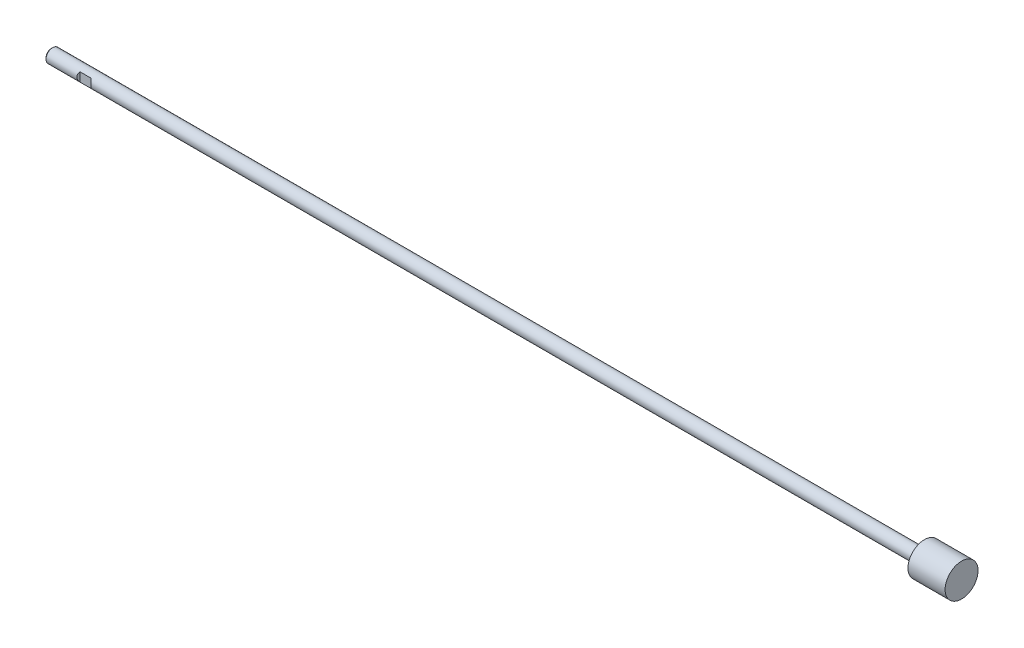
ISO-10303-21;
HEADER;
FILE_DESCRIPTION(('STEP AP214'),'2;1');
FILE_NAME('part.step','',(''),(''),'','','');
FILE_SCHEMA(('AUTOMOTIVE_DESIGN { 1 0 10303 214 1 1 1 1 }'));
ENDSEC;
DATA;
#1=APPLICATION_CONTEXT('core data for automotive mechanical design processes');
#2=APPLICATION_PROTOCOL_DEFINITION('international standard','automotive_design',2000,#1);
#3=PRODUCT_CONTEXT('',#1,'mechanical');
#4=PRODUCT('Part','Part','',(#3));
#5=PRODUCT_RELATED_PRODUCT_CATEGORY('part','',(#4));
#6=PRODUCT_DEFINITION_FORMATION('','',#4);
#7=PRODUCT_DEFINITION_CONTEXT('part definition',#1,'design');
#8=PRODUCT_DEFINITION('design','',#6,#7);
#9=PRODUCT_DEFINITION_SHAPE('','',#8);
#10=(LENGTH_UNIT() NAMED_UNIT(*) SI_UNIT(.MILLI.,.METRE.));
#11=(NAMED_UNIT(*) PLANE_ANGLE_UNIT() SI_UNIT($,.RADIAN.));
#12=(NAMED_UNIT(*) SI_UNIT($,.STERADIAN.) SOLID_ANGLE_UNIT());
#13=UNCERTAINTY_MEASURE_WITH_UNIT(LENGTH_MEASURE(1.E-05),#10,'distance_accuracy_value','');
#14=(GEOMETRIC_REPRESENTATION_CONTEXT(3) GLOBAL_UNCERTAINTY_ASSIGNED_CONTEXT((#13)) GLOBAL_UNIT_ASSIGNED_CONTEXT((#10,
#11,#12)) REPRESENTATION_CONTEXT('',''));
#15=CARTESIAN_POINT('',(0.,0.,0.));
#16=DIRECTION('',(0.,0.,1.));
#17=DIRECTION('',(1.,0.,0.));
#18=AXIS2_PLACEMENT_3D('',#15,#16,#17);
#19=CARTESIAN_POINT('',(0.,0.,0.));
#20=DIRECTION('',(1.,0.,0.));
#21=DIRECTION('',(0.,0.,-1.));
#22=AXIS2_PLACEMENT_3D('',#19,#20,#21);
#23=PLANE('',#22);
#24=CARTESIAN_POINT('',(0.,0.,0.));
#25=DIRECTION('',(-1.,0.,0.));
#26=DIRECTION('',(0.,0.,1.));
#27=AXIS2_PLACEMENT_3D('',#24,#25,#26);
#28=CIRCLE('',#27,3.233);
#29=CARTESIAN_POINT('',(0.,0.,3.233));
#30=VERTEX_POINT('',#29);
#31=EDGE_CURVE('E83',#30,#30,#28,.T.);
#32=ORIENTED_EDGE('',*,*,#31,.T.);
#33=EDGE_LOOP('',(#32));
#34=FACE_BOUND('',#33,.T.);
#35=ADVANCED_FACE('F39',(#34),#23,.F.);
#36=CARTESIAN_POINT('',(0.766999999999962,0.,0.));
#37=DIRECTION('',(1.,0.,0.));
#38=DIRECTION('',(0.,0.,-1.));
#39=AXIS2_PLACEMENT_3D('',#36,#37,#38);
#40=CONICAL_SURFACE('',#39,4.,0.785398163397473);
#41=ORIENTED_EDGE('',*,*,#31,.F.);
#42=EDGE_LOOP('',(#41));
#43=FACE_BOUND('',#42,.T.);
#44=CARTESIAN_POINT('',(0.766999999999962,0.,0.));
#45=DIRECTION('',(-1.,0.,0.));
#46=DIRECTION('',(0.,0.,1.));
#47=AXIS2_PLACEMENT_3D('',#44,#45,#46);
#48=CIRCLE('',#47,4.);
#49=CARTESIAN_POINT('',(0.766999999999962,0.,4.));
#50=VERTEX_POINT('',#49);
#51=EDGE_CURVE('E128',#50,#50,#48,.T.);
#52=ORIENTED_EDGE('',*,*,#51,.T.);
#53=EDGE_LOOP('',(#52));
#54=FACE_BOUND('',#53,.T.);
#55=ADVANCED_FACE('F134',(#43,#54),#40,.T.);
#56=CARTESIAN_POINT('',(539.,0.,0.));
#57=DIRECTION('',(-1.,0.,0.));
#58=DIRECTION('',(0.,0.,1.));
#59=AXIS2_PLACEMENT_3D('',#56,#57,#58);
#60=CYLINDRICAL_SURFACE('',#59,4.);
#61=DIRECTION('',(-1.,0.,0.));
#62=VECTOR('',#61,1.);
#63=CARTESIAN_POINT('',(539.,-2.64575131106459,-3.));
#64=LINE('',#63,#62);
#65=CARTESIAN_POINT('',(20.,-2.64575131106458,-3.));
#66=VERTEX_POINT('',#65);
#67=CARTESIAN_POINT('',(26.4,-2.64575131106459,-3.));
#68=VERTEX_POINT('',#67);
#69=EDGE_CURVE('E104',#66,#68,#64,.F.);
#70=ORIENTED_EDGE('',*,*,#69,.T.);
#71=CARTESIAN_POINT('',(23.4,0.,0.));
#72=DIRECTION('',(0.707106781186548,0.,0.707106781186548));
#73=DIRECTION('',(-0.707106781186548,0.,0.707106781186548));
#74=AXIS2_PLACEMENT_3D('',#71,#72,#73);
#75=ELLIPSE('',#74,5.65685424949238,4.);
#76=CARTESIAN_POINT('',(26.4,2.64575131106459,-3.));
#77=VERTEX_POINT('',#76);
#78=EDGE_CURVE('E11',#68,#77,#75,.T.);
#79=ORIENTED_EDGE('',*,*,#78,.T.);
#80=DIRECTION('',(-1.,0.,0.));
#81=VECTOR('',#80,1.);
#82=CARTESIAN_POINT('',(539.,2.64575131106459,-3.));
#83=LINE('',#82,#81);
#84=CARTESIAN_POINT('',(20.,2.64575131106458,-3.));
#85=VERTEX_POINT('',#84);
#86=EDGE_CURVE('E46',#77,#85,#83,.T.);
#87=ORIENTED_EDGE('',*,*,#86,.T.);
#88=CARTESIAN_POINT('',(23.,0.,0.));
#89=DIRECTION('',(-0.707106781186548,0.,0.707106781186547));
#90=DIRECTION('',(-0.707106781186547,0.,-0.707106781186548));
#91=AXIS2_PLACEMENT_3D('',#88,#89,#90);
#92=ELLIPSE('',#91,5.65685424949238,4.);
#93=EDGE_CURVE('E101',#85,#66,#92,.T.);
#94=ORIENTED_EDGE('',*,*,#93,.T.);
#95=EDGE_LOOP('',(#70,#79,#87,#94));
#96=FACE_BOUND('',#95,.T.);
#97=DIRECTION('',(-1.,0.,0.));
#98=VECTOR('',#97,1.);
#99=CARTESIAN_POINT('',(539.,-2.64575131106459,3.));
#100=LINE('',#99,#98);
#101=CARTESIAN_POINT('',(26.4,-2.64575131106458,3.));
#102=VERTEX_POINT('',#101);
#103=CARTESIAN_POINT('',(20.,-2.64575131106459,3.));
#104=VERTEX_POINT('',#103);
#105=EDGE_CURVE('E89',#102,#104,#100,.T.);
#106=ORIENTED_EDGE('',*,*,#105,.T.);
#107=CARTESIAN_POINT('',(23.0000000000001,0.,0.));
#108=DIRECTION('',(-0.707106781186547,0.,-0.707106781186548));
#109=DIRECTION('',(-0.707106781186548,0.,0.707106781186547));
#110=AXIS2_PLACEMENT_3D('',#107,#108,#109);
#111=ELLIPSE('',#110,5.65685424949239,4.);
#112=CARTESIAN_POINT('',(20.,2.64575131106459,3.));
#113=VERTEX_POINT('',#112);
#114=EDGE_CURVE('E95',#104,#113,#111,.T.);
#115=ORIENTED_EDGE('',*,*,#114,.T.);
#116=DIRECTION('',(-1.,0.,0.));
#117=VECTOR('',#116,1.);
#118=CARTESIAN_POINT('',(539.,2.64575131106459,3.));
#119=LINE('',#118,#117);
#120=CARTESIAN_POINT('',(26.4,2.64575131106458,3.));
#121=VERTEX_POINT('',#120);
#122=EDGE_CURVE('E82',#113,#121,#119,.F.);
#123=ORIENTED_EDGE('',*,*,#122,.T.);
#124=CARTESIAN_POINT('',(23.4,0.,0.));
#125=DIRECTION('',(0.707106781186548,0.,-0.707106781186548));
#126=DIRECTION('',(-0.707106781186548,0.,-0.707106781186548));
#127=AXIS2_PLACEMENT_3D('',#124,#125,#126);
#128=ELLIPSE('',#127,5.65685424949238,4.);
#129=EDGE_CURVE('E77',#121,#102,#128,.T.);
#130=ORIENTED_EDGE('',*,*,#129,.T.);
#131=EDGE_LOOP('',(#106,#115,#123,#130));
#132=FACE_BOUND('',#131,.T.);
#133=ORIENTED_EDGE('',*,*,#51,.F.);
#134=EDGE_LOOP('',(#133));
#135=FACE_BOUND('',#134,.T.);
#136=CARTESIAN_POINT('',(517.,0.,0.));
#137=DIRECTION('',(-1.,0.,0.));
#138=DIRECTION('',(0.,0.,1.));
#139=AXIS2_PLACEMENT_3D('',#136,#137,#138);
#140=CIRCLE('',#139,4.);
#141=CARTESIAN_POINT('',(517.,0.,4.));
#142=VERTEX_POINT('',#141);
#143=EDGE_CURVE('E125',#142,#142,#140,.T.);
#144=ORIENTED_EDGE('',*,*,#143,.T.);
#145=EDGE_LOOP('',(#144));
#146=FACE_BOUND('',#145,.T.);
#147=ADVANCED_FACE('F93',(#96,#132,#135,#146),#60,.T.);
#148=CARTESIAN_POINT('',(517.,4.,0.));
#149=DIRECTION('',(1.,0.,0.));
#150=DIRECTION('',(0.,0.,-1.));
#151=AXIS2_PLACEMENT_3D('',#148,#149,#150);
#152=PLANE('',#151);
#153=ORIENTED_EDGE('',*,*,#143,.F.);
#154=EDGE_LOOP('',(#153));
#155=FACE_BOUND('',#154,.T.);
#156=CARTESIAN_POINT('',(517.,0.,0.));
#157=DIRECTION('',(-1.,0.,0.));
#158=DIRECTION('',(0.,0.,1.));
#159=AXIS2_PLACEMENT_3D('',#156,#157,#158);
#160=CIRCLE('',#159,9.75);
#161=CARTESIAN_POINT('',(517.,0.,9.75));
#162=VERTEX_POINT('',#161);
#163=EDGE_CURVE('E118',#162,#162,#160,.T.);
#164=ORIENTED_EDGE('',*,*,#163,.T.);
#165=EDGE_LOOP('',(#164));
#166=FACE_BOUND('',#165,.T.);
#167=ADVANCED_FACE('F140',(#155,#166),#152,.F.);
#168=CARTESIAN_POINT('',(539.,0.,0.));
#169=DIRECTION('',(-1.,0.,0.));
#170=DIRECTION('',(0.,0.,1.));
#171=AXIS2_PLACEMENT_3D('',#168,#169,#170);
#172=CYLINDRICAL_SURFACE('',#171,9.75);
#173=ORIENTED_EDGE('',*,*,#163,.F.);
#174=EDGE_LOOP('',(#173));
#175=FACE_BOUND('',#174,.T.);
#176=CARTESIAN_POINT('',(539.,0.,0.));
#177=DIRECTION('',(-1.,0.,0.));
#178=DIRECTION('',(0.,0.,1.));
#179=AXIS2_PLACEMENT_3D('',#176,#177,#178);
#180=CIRCLE('',#179,9.75);
#181=CARTESIAN_POINT('',(539.,0.,9.75));
#182=VERTEX_POINT('',#181);
#183=EDGE_CURVE('E115',#182,#182,#180,.T.);
#184=ORIENTED_EDGE('',*,*,#183,.T.);
#185=EDGE_LOOP('',(#184));
#186=FACE_BOUND('',#185,.T.);
#187=ADVANCED_FACE('F146',(#175,#186),#172,.T.);
#188=CARTESIAN_POINT('',(539.,9.75,0.));
#189=DIRECTION('',(-1.,0.,0.));
#190=DIRECTION('',(0.,0.,1.));
#191=AXIS2_PLACEMENT_3D('',#188,#189,#190);
#192=PLANE('',#191);
#193=ORIENTED_EDGE('',*,*,#183,.F.);
#194=EDGE_LOOP('',(#193));
#195=FACE_BOUND('',#194,.T.);
#196=ADVANCED_FACE('F152',(#195),#192,.F.);
#197=CARTESIAN_POINT('',(35.4,-3.,12.));
#198=DIRECTION('',(0.707106781186548,0.,-0.707106781186548));
#199=DIRECTION('',(-0.707106781186548,0.,-0.707106781186548));
#200=AXIS2_PLACEMENT_3D('',#197,#198,#199);
#201=PLANE('',#200);
#202=DIRECTION('',(0.,1.,0.));
#203=VECTOR('',#202,1.);
#204=CARTESIAN_POINT('',(26.4,-3.,3.));
#205=LINE('',#204,#203);
#206=EDGE_CURVE('E59',#102,#121,#205,.T.);
#207=ORIENTED_EDGE('',*,*,#206,.F.);
#208=ORIENTED_EDGE('',*,*,#129,.F.);
#209=EDGE_LOOP('',(#207,#208));
#210=FACE_BOUND('',#209,.T.);
#211=ADVANCED_FACE('F78',(#210),#201,.F.);
#212=CARTESIAN_POINT('',(26.4,-3.,3.));
#213=DIRECTION('',(0.,0.,-1.));
#214=DIRECTION('',(-1.,0.,0.));
#215=AXIS2_PLACEMENT_3D('',#212,#213,#214);
#216=PLANE('',#215);
#217=ORIENTED_EDGE('',*,*,#206,.T.);
#218=ORIENTED_EDGE('',*,*,#122,.F.);
#219=DIRECTION('',(0.,1.,0.));
#220=VECTOR('',#219,1.);
#221=CARTESIAN_POINT('',(20.,-3.,3.));
#222=LINE('',#221,#220);
#223=EDGE_CURVE('E90',#104,#113,#222,.T.);
#224=ORIENTED_EDGE('',*,*,#223,.F.);
#225=ORIENTED_EDGE('',*,*,#105,.F.);
#226=EDGE_LOOP('',(#217,#218,#224,#225));
#227=FACE_BOUND('',#226,.T.);
#228=ADVANCED_FACE('F86',(#227),#216,.F.);
#229=CARTESIAN_POINT('',(20.,-3.,3.));
#230=DIRECTION('',(-0.707106781186547,0.,-0.707106781186548));
#231=DIRECTION('',(-0.707106781186548,0.,0.707106781186547));
#232=AXIS2_PLACEMENT_3D('',#229,#230,#231);
#233=PLANE('',#232);
#234=ORIENTED_EDGE('',*,*,#223,.T.);
#235=ORIENTED_EDGE('',*,*,#114,.F.);
#236=EDGE_LOOP('',(#234,#235));
#237=FACE_BOUND('',#236,.T.);
#238=ADVANCED_FACE('F213',(#237),#233,.F.);
#239=CARTESIAN_POINT('',(26.4,-3.,-3.));
#240=DIRECTION('',(0.707106781186548,0.,0.707106781186548));
#241=DIRECTION('',(0.707106781186548,0.,-0.707106781186548));
#242=AXIS2_PLACEMENT_3D('',#239,#240,#241);
#243=PLANE('',#242);
#244=DIRECTION('',(0.,1.,0.));
#245=VECTOR('',#244,1.);
#246=CARTESIAN_POINT('',(26.4,-3.,-3.));
#247=LINE('',#246,#245);
#248=EDGE_CURVE('E112',#68,#77,#247,.T.);
#249=ORIENTED_EDGE('',*,*,#248,.T.);
#250=ORIENTED_EDGE('',*,*,#78,.F.);
#251=EDGE_LOOP('',(#249,#250));
#252=FACE_BOUND('',#251,.T.);
#253=ADVANCED_FACE('F114',(#252),#243,.F.);
#254=CARTESIAN_POINT('',(20.,-3.,-3.));
#255=DIRECTION('',(0.,0.,1.));
#256=DIRECTION('',(1.,0.,0.));
#257=AXIS2_PLACEMENT_3D('',#254,#255,#256);
#258=PLANE('',#257);
#259=ORIENTED_EDGE('',*,*,#248,.F.);
#260=ORIENTED_EDGE('',*,*,#69,.F.);
#261=DIRECTION('',(0.,1.,0.));
#262=VECTOR('',#261,1.);
#263=CARTESIAN_POINT('',(20.,-3.,-3.));
#264=LINE('',#263,#262);
#265=EDGE_CURVE('E52',#66,#85,#264,.T.);
#266=ORIENTED_EDGE('',*,*,#265,.T.);
#267=ORIENTED_EDGE('',*,*,#86,.F.);
#268=EDGE_LOOP('',(#259,#260,#266,#267));
#269=FACE_BOUND('',#268,.T.);
#270=ADVANCED_FACE('F111',(#269),#258,.F.);
#271=CARTESIAN_POINT('',(18.,-3.,-5.));
#272=DIRECTION('',(-0.707106781186548,0.,0.707106781186547));
#273=DIRECTION('',(0.707106781186547,0.,0.707106781186548));
#274=AXIS2_PLACEMENT_3D('',#271,#272,#273);
#275=PLANE('',#274);
#276=ORIENTED_EDGE('',*,*,#265,.F.);
#277=ORIENTED_EDGE('',*,*,#93,.F.);
#278=EDGE_LOOP('',(#276,#277));
#279=FACE_BOUND('',#278,.T.);
#280=ADVANCED_FACE('F242',(#279),#275,.F.);
#281=CLOSED_SHELL('',(#35,#55,#147,#167,#187,#196,#211,#228,#238,#253,#270,#280));
#282=MANIFOLD_SOLID_BREP('B2',#281);
#283=ADVANCED_BREP_SHAPE_REPRESENTATION('',(#18,#282),#14);
#284=SHAPE_DEFINITION_REPRESENTATION(#9,#283);
ENDSEC;
END-ISO-10303-21;
